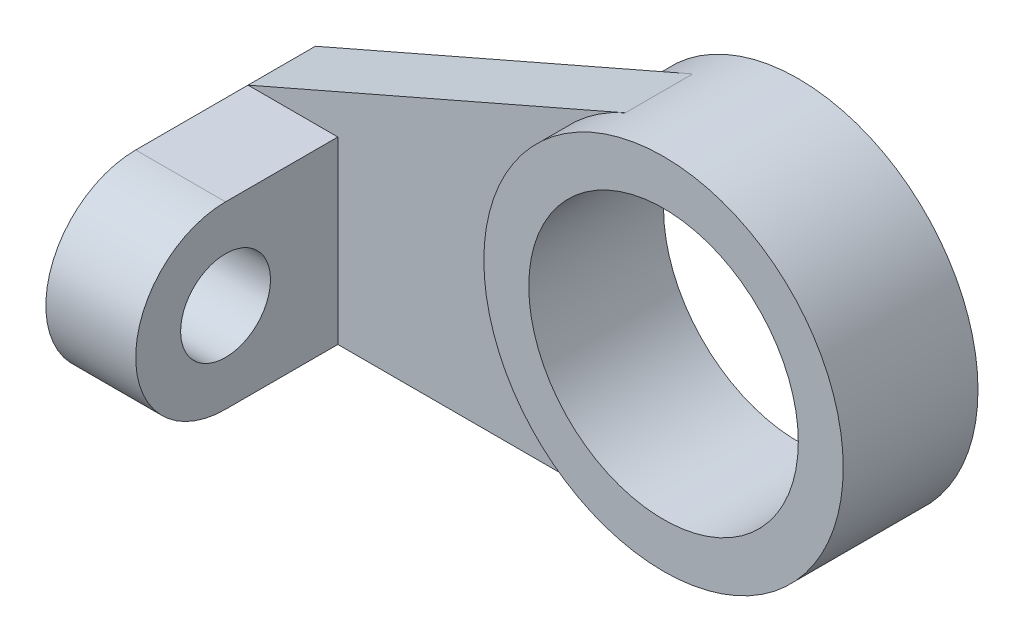
ISO-10303-21;
HEADER;
FILE_DESCRIPTION(('STEP AP214'),'2;1');
FILE_NAME('part.step','',(''),(''),'','','');
FILE_SCHEMA(('AUTOMOTIVE_DESIGN { 1 0 10303 214 1 1 1 1 }'));
ENDSEC;
DATA;
#1=APPLICATION_CONTEXT('core data for automotive mechanical design processes');
#2=APPLICATION_PROTOCOL_DEFINITION('international standard','automotive_design',2000,#1);
#3=PRODUCT_CONTEXT('',#1,'mechanical');
#4=PRODUCT('Part','Part','',(#3));
#5=PRODUCT_RELATED_PRODUCT_CATEGORY('part','',(#4));
#6=PRODUCT_DEFINITION_FORMATION('','',#4);
#7=PRODUCT_DEFINITION_CONTEXT('part definition',#1,'design');
#8=PRODUCT_DEFINITION('design','',#6,#7);
#9=PRODUCT_DEFINITION_SHAPE('','',#8);
#10=(LENGTH_UNIT() NAMED_UNIT(*) SI_UNIT(.MILLI.,.METRE.));
#11=(NAMED_UNIT(*) PLANE_ANGLE_UNIT() SI_UNIT($,.RADIAN.));
#12=(NAMED_UNIT(*) SI_UNIT($,.STERADIAN.) SOLID_ANGLE_UNIT());
#13=UNCERTAINTY_MEASURE_WITH_UNIT(LENGTH_MEASURE(1.E-05),#10,'distance_accuracy_value','');
#14=(GEOMETRIC_REPRESENTATION_CONTEXT(3) GLOBAL_UNCERTAINTY_ASSIGNED_CONTEXT((#13)) GLOBAL_UNIT_ASSIGNED_CONTEXT((#10,
#11,#12)) REPRESENTATION_CONTEXT('',''));
#15=CARTESIAN_POINT('',(0.,0.,0.));
#16=DIRECTION('',(0.,0.,1.));
#17=DIRECTION('',(1.,0.,0.));
#18=AXIS2_PLACEMENT_3D('',#15,#16,#17);
#19=CARTESIAN_POINT('',(0.,0.,9.525));
#20=DIRECTION('',(0.,0.,1.));
#21=DIRECTION('',(1.,0.,0.));
#22=AXIS2_PLACEMENT_3D('',#19,#20,#21);
#23=PLANE('',#22);
#24=DIRECTION('',(-1.,0.,0.));
#25=VECTOR('',#24,1.);
#26=CARTESIAN_POINT('',(-127.,0.,9.525));
#27=LINE('',#26,#25);
#28=CARTESIAN_POINT('',(-101.6,0.,9.525));
#29=VERTEX_POINT('',#28);
#30=CARTESIAN_POINT('',(-127.,0.,9.525));
#31=VERTEX_POINT('',#30);
#32=EDGE_CURVE('E136',#29,#31,#27,.T.);
#33=ORIENTED_EDGE('',*,*,#32,.F.);
#34=DIRECTION('',(0.,1.,0.));
#35=VECTOR('',#34,1.);
#36=CARTESIAN_POINT('',(-101.6,-50.8,9.525));
#37=LINE('',#36,#35);
#38=CARTESIAN_POINT('',(-101.6,-50.8,9.525));
#39=VERTEX_POINT('',#38);
#40=EDGE_CURVE('E146',#39,#29,#37,.T.);
#41=ORIENTED_EDGE('',*,*,#40,.F.);
#42=DIRECTION('',(1.,0.,0.));
#43=VECTOR('',#42,1.);
#44=CARTESIAN_POINT('',(0.,-50.8,9.525));
#45=LINE('',#44,#43);
#46=CARTESIAN_POINT('',(0.,-50.8,9.525));
#47=VERTEX_POINT('',#46);
#48=EDGE_CURVE('E176',#39,#47,#45,.T.);
#49=ORIENTED_EDGE('',*,*,#48,.T.);
#50=CARTESIAN_POINT('',(0.,0.,9.525));
#51=DIRECTION('',(0.,0.,-1.));
#52=DIRECTION('',(1.,0.,0.));
#53=AXIS2_PLACEMENT_3D('',#50,#51,#52);
#54=CIRCLE('',#53,50.8);
#55=CARTESIAN_POINT('',(-20.32,46.5589690607513,9.525));
#56=VERTEX_POINT('',#55);
#57=EDGE_CURVE('E167',#47,#56,#54,.T.);
#58=ORIENTED_EDGE('',*,*,#57,.T.);
#59=DIRECTION('',(-0.916515138991168,-0.4,0.));
#60=VECTOR('',#59,1.);
#61=CARTESIAN_POINT('',(-127.,0.,9.525));
#62=LINE('',#61,#60);
#63=EDGE_CURVE('E171',#56,#31,#62,.T.);
#64=ORIENTED_EDGE('',*,*,#63,.T.);
#65=EDGE_LOOP('',(#33,#41,#49,#58,#64));
#66=FACE_BOUND('',#65,.T.);
#67=ADVANCED_FACE('F51',(#66),#23,.T.);
#68=CARTESIAN_POINT('',(0.,0.,19.05));
#69=DIRECTION('',(0.,0.,1.));
#70=DIRECTION('',(1.,0.,0.));
#71=AXIS2_PLACEMENT_3D('',#68,#69,#70);
#72=PLANE('',#71);
#73=CARTESIAN_POINT('',(0.,0.,19.05));
#74=DIRECTION('',(0.,0.,1.));
#75=DIRECTION('',(1.,0.,0.));
#76=AXIS2_PLACEMENT_3D('',#73,#74,#75);
#77=CIRCLE('',#76,50.8);
#78=CARTESIAN_POINT('',(50.8,0.,19.05));
#79=VERTEX_POINT('',#78);
#80=EDGE_CURVE('E12',#79,#79,#77,.T.);
#81=ORIENTED_EDGE('',*,*,#80,.T.);
#82=EDGE_LOOP('',(#81));
#83=FACE_BOUND('',#82,.T.);
#84=CARTESIAN_POINT('',(0.,0.,19.05));
#85=DIRECTION('',(0.,0.,1.));
#86=DIRECTION('',(1.,0.,0.));
#87=AXIS2_PLACEMENT_3D('',#84,#85,#86);
#88=CIRCLE('',#87,38.1);
#89=CARTESIAN_POINT('',(-38.1,0.,19.05));
#90=VERTEX_POINT('',#89);
#91=EDGE_CURVE('E195',#90,#90,#88,.T.);
#92=ORIENTED_EDGE('',*,*,#91,.F.);
#93=EDGE_LOOP('',(#92));
#94=FACE_BOUND('',#93,.T.);
#95=ADVANCED_FACE('F218',(#83,#94),#72,.T.);
#96=CARTESIAN_POINT('',(0.,0.,-19.05));
#97=DIRECTION('',(0.,0.,1.));
#98=DIRECTION('',(1.,0.,0.));
#99=AXIS2_PLACEMENT_3D('',#96,#97,#98);
#100=PLANE('',#99);
#101=CARTESIAN_POINT('',(0.,0.,-19.05));
#102=DIRECTION('',(0.,0.,1.));
#103=DIRECTION('',(1.,0.,0.));
#104=AXIS2_PLACEMENT_3D('',#101,#102,#103);
#105=CIRCLE('',#104,50.8);
#106=CARTESIAN_POINT('',(50.8,0.,-19.05));
#107=VERTEX_POINT('',#106);
#108=EDGE_CURVE('E55',#107,#107,#105,.T.);
#109=ORIENTED_EDGE('',*,*,#108,.F.);
#110=EDGE_LOOP('',(#109));
#111=FACE_BOUND('',#110,.T.);
#112=CARTESIAN_POINT('',(0.,0.,-19.05));
#113=DIRECTION('',(0.,0.,1.));
#114=DIRECTION('',(1.,0.,0.));
#115=AXIS2_PLACEMENT_3D('',#112,#113,#114);
#116=CIRCLE('',#115,38.1);
#117=CARTESIAN_POINT('',(-38.1,0.,-19.05));
#118=VERTEX_POINT('',#117);
#119=EDGE_CURVE('E194',#118,#118,#116,.T.);
#120=ORIENTED_EDGE('',*,*,#119,.T.);
#121=EDGE_LOOP('',(#120));
#122=FACE_BOUND('',#121,.T.);
#123=ADVANCED_FACE('F203',(#111,#122),#100,.F.);
#124=CARTESIAN_POINT('',(0.,0.,19.05));
#125=DIRECTION('',(0.,0.,-1.));
#126=DIRECTION('',(-1.,0.,0.));
#127=AXIS2_PLACEMENT_3D('',#124,#125,#126);
#128=CYLINDRICAL_SURFACE('',#127,50.8);
#129=DIRECTION('',(0.,0.,-1.));
#130=VECTOR('',#129,1.);
#131=CARTESIAN_POINT('',(-20.32,46.5589690607513,9.525));
#132=LINE('',#131,#130);
#133=CARTESIAN_POINT('',(-20.32,46.5589690607513,-9.525));
#134=VERTEX_POINT('',#133);
#135=EDGE_CURVE('E75',#56,#134,#132,.T.);
#136=ORIENTED_EDGE('',*,*,#135,.F.);
#137=ORIENTED_EDGE('',*,*,#57,.F.);
#138=DIRECTION('',(0.,0.,-1.));
#139=VECTOR('',#138,1.);
#140=CARTESIAN_POINT('',(0.,-50.8,9.525));
#141=LINE('',#140,#139);
#142=CARTESIAN_POINT('',(0.,-50.8,-9.525));
#143=VERTEX_POINT('',#142);
#144=EDGE_CURVE('E124',#47,#143,#141,.T.);
#145=ORIENTED_EDGE('',*,*,#144,.T.);
#146=CARTESIAN_POINT('',(0.,0.,-9.525));
#147=DIRECTION('',(0.,0.,-1.));
#148=DIRECTION('',(1.,0.,0.));
#149=AXIS2_PLACEMENT_3D('',#146,#147,#148);
#150=CIRCLE('',#149,50.8);
#151=EDGE_CURVE('E166',#143,#134,#150,.T.);
#152=ORIENTED_EDGE('',*,*,#151,.T.);
#153=EDGE_LOOP('',(#136,#137,#145,#152));
#154=FACE_BOUND('',#153,.T.);
#155=ORIENTED_EDGE('',*,*,#80,.F.);
#156=EDGE_LOOP('',(#155));
#157=FACE_BOUND('',#156,.T.);
#158=ORIENTED_EDGE('',*,*,#108,.T.);
#159=EDGE_LOOP('',(#158));
#160=FACE_BOUND('',#159,.T.);
#161=ADVANCED_FACE('F53',(#154,#157,#160),#128,.T.);
#162=CARTESIAN_POINT('',(0.,0.,19.05));
#163=DIRECTION('',(0.,0.,-1.));
#164=DIRECTION('',(-1.,0.,0.));
#165=AXIS2_PLACEMENT_3D('',#162,#163,#164);
#166=CYLINDRICAL_SURFACE('',#165,38.1);
#167=CARTESIAN_POINT('',(-38.1,0.,19.05));
#168=CARTESIAN_POINT('',(-38.1,0.,18.653125));
#169=CARTESIAN_POINT('',(-38.1,0.,18.25625));
#170=CARTESIAN_POINT('',(-38.1,0.,17.4625));
#171=CARTESIAN_POINT('',(-38.1,0.,17.065625));
#172=CARTESIAN_POINT('',(-38.1,0.,16.271875));
#173=CARTESIAN_POINT('',(-38.1,0.,15.875));
#174=CARTESIAN_POINT('',(-38.1,0.,15.08125));
#175=CARTESIAN_POINT('',(-38.1,0.,14.684375));
#176=CARTESIAN_POINT('',(-38.1,0.,13.890625));
#177=CARTESIAN_POINT('',(-38.1,0.,13.49375));
#178=CARTESIAN_POINT('',(-38.1,0.,12.7));
#179=CARTESIAN_POINT('',(-38.1,0.,12.303125));
#180=CARTESIAN_POINT('',(-38.1,0.,11.509375));
#181=CARTESIAN_POINT('',(-38.1,0.,11.1125));
#182=CARTESIAN_POINT('',(-38.1,0.,10.31875));
#183=CARTESIAN_POINT('',(-38.1,0.,9.921875));
#184=CARTESIAN_POINT('',(-38.1,0.,9.128125));
#185=CARTESIAN_POINT('',(-38.1,0.,8.73125));
#186=CARTESIAN_POINT('',(-38.1,0.,7.9375));
#187=CARTESIAN_POINT('',(-38.1,0.,7.540625));
#188=CARTESIAN_POINT('',(-38.1,0.,6.746875));
#189=CARTESIAN_POINT('',(-38.1,0.,6.35));
#190=CARTESIAN_POINT('',(-38.1,0.,5.55625));
#191=CARTESIAN_POINT('',(-38.1,0.,5.159375));
#192=CARTESIAN_POINT('',(-38.1,0.,4.365625));
#193=CARTESIAN_POINT('',(-38.1,0.,3.96875));
#194=CARTESIAN_POINT('',(-38.1,0.,3.175));
#195=CARTESIAN_POINT('',(-38.1,0.,2.778125));
#196=CARTESIAN_POINT('',(-38.1,0.,1.984375));
#197=CARTESIAN_POINT('',(-38.1,0.,1.5875));
#198=CARTESIAN_POINT('',(-38.1,0.,0.79375));
#199=CARTESIAN_POINT('',(-38.1,0.,0.396875));
#200=CARTESIAN_POINT('',(-38.1,0.,-0.396875));
#201=CARTESIAN_POINT('',(-38.1,0.,-0.79375));
#202=CARTESIAN_POINT('',(-38.1,0.,-1.5875));
#203=CARTESIAN_POINT('',(-38.1,0.,-1.984375));
#204=CARTESIAN_POINT('',(-38.1,0.,-2.778125));
#205=CARTESIAN_POINT('',(-38.1,0.,-3.175));
#206=CARTESIAN_POINT('',(-38.1,0.,-3.96875));
#207=CARTESIAN_POINT('',(-38.1,0.,-4.365625));
#208=CARTESIAN_POINT('',(-38.1,0.,-5.159375));
#209=CARTESIAN_POINT('',(-38.1,0.,-5.55625));
#210=CARTESIAN_POINT('',(-38.1,0.,-6.35));
#211=CARTESIAN_POINT('',(-38.1,0.,-6.746875));
#212=CARTESIAN_POINT('',(-38.1,0.,-7.540625));
#213=CARTESIAN_POINT('',(-38.1,0.,-7.9375));
#214=CARTESIAN_POINT('',(-38.1,0.,-8.73125));
#215=CARTESIAN_POINT('',(-38.1,0.,-9.128125));
#216=CARTESIAN_POINT('',(-38.1,0.,-9.921875));
#217=CARTESIAN_POINT('',(-38.1,0.,-10.31875));
#218=CARTESIAN_POINT('',(-38.1,0.,-11.1125));
#219=CARTESIAN_POINT('',(-38.1,0.,-11.509375));
#220=CARTESIAN_POINT('',(-38.1,0.,-12.303125));
#221=CARTESIAN_POINT('',(-38.1,0.,-12.7));
#222=CARTESIAN_POINT('',(-38.1,0.,-13.49375));
#223=CARTESIAN_POINT('',(-38.1,0.,-13.890625));
#224=CARTESIAN_POINT('',(-38.1,0.,-14.684375));
#225=CARTESIAN_POINT('',(-38.1,0.,-15.08125));
#226=CARTESIAN_POINT('',(-38.1,0.,-15.875));
#227=CARTESIAN_POINT('',(-38.1,0.,-16.271875));
#228=CARTESIAN_POINT('',(-38.1,0.,-17.065625));
#229=CARTESIAN_POINT('',(-38.1,0.,-17.4625));
#230=CARTESIAN_POINT('',(-38.1,0.,-18.25625));
#231=CARTESIAN_POINT('',(-38.1,0.,-18.653125));
#232=CARTESIAN_POINT('',(-38.1,0.,-19.05));
#233=B_SPLINE_CURVE_WITH_KNOTS('',3,(#167,#168,#169,#170,#171,#172,#173,#174,#175,#176,#177,
#178,#179,#180,#181,#182,#183,#184,#185,#186,#187,#188,#189,#190,#191,#192,#193,#194,#195,#196,
#197,#198,#199,#200,#201,#202,#203,#204,#205,#206,#207,#208,#209,#210,#211,#212,#213,#214,#215,
#216,#217,#218,#219,#220,#221,#222,#223,#224,#225,#226,#227,#228,#229,#230,#231,#232),
.UNSPECIFIED.,.F.,.F.,(4,2,2,2,2,2,2,2,2,2,2,2,2,2,2,2,2,2,2,2,2,2,2,2,2,2,2,2,2,2,2,2,4),(0.,
1.190625,2.38125,3.571875,4.7625,5.953125,7.14375,8.334375,9.525,10.715625,11.90625,13.096875,
14.2875,15.478125,16.66875,17.859375,19.05,20.240625,21.43125,22.621875,23.8125,25.003125,
26.19375,27.384375,28.575,29.765625,30.95625,32.146875,33.3375,34.528125,35.71875,36.909375,
38.1),.UNSPECIFIED.);
#234=EDGE_CURVE('BSEAM205',#90,#118,#233,.T.);
#235=ORIENTED_EDGE('',*,*,#91,.T.);
#236=ORIENTED_EDGE('',*,*,#119,.F.);
#237=ORIENTED_EDGE('',*,*,#234,.T.);
#238=ORIENTED_EDGE('',*,*,#234,.F.);
#239=EDGE_LOOP('',(#235,#237,#236,#238));
#240=FACE_BOUND('',#239,.T.);
#241=ADVANCED_FACE('F205',(#240),#166,.F.);
#242=CARTESIAN_POINT('',(-127.,0.,9.525));
#243=DIRECTION('',(0.4,-0.916515138991168,0.));
#244=DIRECTION('',(0.916515138991168,0.4,0.));
#245=AXIS2_PLACEMENT_3D('',#242,#243,#244);
#246=PLANE('',#245);
#247=DIRECTION('',(-0.916515138991168,-0.4,0.));
#248=VECTOR('',#247,1.);
#249=CARTESIAN_POINT('',(-127.,0.,-9.525));
#250=LINE('',#249,#248);
#251=CARTESIAN_POINT('',(-127.,0.,-9.525));
#252=VERTEX_POINT('',#251);
#253=EDGE_CURVE('E181',#134,#252,#250,.T.);
#254=ORIENTED_EDGE('',*,*,#253,.T.);
#255=DIRECTION('',(0.,0.,-1.));
#256=VECTOR('',#255,1.);
#257=CARTESIAN_POINT('',(-127.,0.,9.525));
#258=LINE('',#257,#256);
#259=EDGE_CURVE('E123',#31,#252,#258,.T.);
#260=ORIENTED_EDGE('',*,*,#259,.F.);
#261=ORIENTED_EDGE('',*,*,#63,.F.);
#262=ORIENTED_EDGE('',*,*,#135,.T.);
#263=EDGE_LOOP('',(#254,#260,#261,#262));
#264=FACE_BOUND('',#263,.T.);
#265=ADVANCED_FACE('F207',(#264),#246,.F.);
#266=CARTESIAN_POINT('',(-127.,-50.8,9.525));
#267=DIRECTION('',(1.,0.,0.));
#268=DIRECTION('',(0.,0.,-1.));
#269=AXIS2_PLACEMENT_3D('',#266,#267,#268);
#270=PLANE('',#269);
#271=DIRECTION('',(0.,0.,-1.));
#272=VECTOR('',#271,1.);
#273=CARTESIAN_POINT('',(-127.,-50.8,9.525));
#274=LINE('',#273,#272);
#275=CARTESIAN_POINT('',(-127.,-50.8,41.275));
#276=VERTEX_POINT('',#275);
#277=CARTESIAN_POINT('',(-127.,-50.8,-9.525));
#278=VERTEX_POINT('',#277);
#279=EDGE_CURVE('E109',#276,#278,#274,.T.);
#280=ORIENTED_EDGE('',*,*,#279,.F.);
#281=CARTESIAN_POINT('',(-127.,-25.4,41.275));
#282=DIRECTION('',(-1.,0.,0.));
#283=DIRECTION('',(0.,0.,1.));
#284=AXIS2_PLACEMENT_3D('',#281,#282,#283);
#285=CIRCLE('',#284,25.4);
#286=CARTESIAN_POINT('',(-127.,0.,41.275));
#287=VERTEX_POINT('',#286);
#288=EDGE_CURVE('E115',#276,#287,#285,.T.);
#289=ORIENTED_EDGE('',*,*,#288,.T.);
#290=DIRECTION('',(0.,0.,-1.));
#291=VECTOR('',#290,1.);
#292=CARTESIAN_POINT('',(-127.,0.,41.275));
#293=LINE('',#292,#291);
#294=EDGE_CURVE('E155',#287,#31,#293,.T.);
#295=ORIENTED_EDGE('',*,*,#294,.T.);
#296=ORIENTED_EDGE('',*,*,#259,.T.);
#297=DIRECTION('',(0.,-1.,0.));
#298=VECTOR('',#297,1.);
#299=CARTESIAN_POINT('',(-127.,-50.8,-9.525));
#300=LINE('',#299,#298);
#301=EDGE_CURVE('E118',#252,#278,#300,.T.);
#302=ORIENTED_EDGE('',*,*,#301,.T.);
#303=EDGE_LOOP('',(#280,#289,#295,#296,#302));
#304=FACE_BOUND('',#303,.T.);
#305=CARTESIAN_POINT('',(-127.,-25.4,41.275));
#306=DIRECTION('',(-1.,0.,0.));
#307=DIRECTION('',(0.,0.,1.));
#308=AXIS2_PLACEMENT_3D('',#305,#306,#307);
#309=CIRCLE('',#308,12.7);
#310=CARTESIAN_POINT('',(-127.,-25.4,53.975));
#311=VERTEX_POINT('',#310);
#312=EDGE_CURVE('E149',#311,#311,#309,.T.);
#313=ORIENTED_EDGE('',*,*,#312,.F.);
#314=EDGE_LOOP('',(#313));
#315=FACE_BOUND('',#314,.T.);
#316=ADVANCED_FACE('F111',(#304,#315),#270,.F.);
#317=CARTESIAN_POINT('',(0.,-50.8,9.525));
#318=DIRECTION('',(0.,1.,0.));
#319=DIRECTION('',(-1.,0.,0.));
#320=AXIS2_PLACEMENT_3D('',#317,#318,#319);
#321=PLANE('',#320);
#322=DIRECTION('',(1.,0.,0.));
#323=VECTOR('',#322,1.);
#324=CARTESIAN_POINT('',(0.,-50.8,-9.525));
#325=LINE('',#324,#323);
#326=EDGE_CURVE('E172',#278,#143,#325,.T.);
#327=ORIENTED_EDGE('',*,*,#326,.T.);
#328=ORIENTED_EDGE('',*,*,#144,.F.);
#329=ORIENTED_EDGE('',*,*,#48,.F.);
#330=DIRECTION('',(0.,0.,-1.));
#331=VECTOR('',#330,1.);
#332=CARTESIAN_POINT('',(-101.6,-50.8,41.275));
#333=LINE('',#332,#331);
#334=CARTESIAN_POINT('',(-101.6,-50.8,41.275));
#335=VERTEX_POINT('',#334);
#336=EDGE_CURVE('E130',#335,#39,#333,.T.);
#337=ORIENTED_EDGE('',*,*,#336,.F.);
#338=DIRECTION('',(1.,0.,0.));
#339=VECTOR('',#338,1.);
#340=CARTESIAN_POINT('',(-127.,-50.8,41.275));
#341=LINE('',#340,#339);
#342=EDGE_CURVE('E127',#276,#335,#341,.T.);
#343=ORIENTED_EDGE('',*,*,#342,.F.);
#344=ORIENTED_EDGE('',*,*,#279,.T.);
#345=EDGE_LOOP('',(#327,#328,#329,#337,#343,#344));
#346=FACE_BOUND('',#345,.T.);
#347=ADVANCED_FACE('F128',(#346),#321,.F.);
#348=CARTESIAN_POINT('',(0.,0.,-9.525));
#349=DIRECTION('',(0.,0.,1.));
#350=DIRECTION('',(1.,0.,0.));
#351=AXIS2_PLACEMENT_3D('',#348,#349,#350);
#352=PLANE('',#351);
#353=ORIENTED_EDGE('',*,*,#151,.F.);
#354=ORIENTED_EDGE('',*,*,#326,.F.);
#355=ORIENTED_EDGE('',*,*,#301,.F.);
#356=ORIENTED_EDGE('',*,*,#253,.F.);
#357=EDGE_LOOP('',(#353,#354,#355,#356));
#358=FACE_BOUND('',#357,.T.);
#359=ADVANCED_FACE('F230',(#358),#352,.F.);
#360=CARTESIAN_POINT('',(-101.6,-50.8,41.275));
#361=DIRECTION('',(-1.,0.,0.));
#362=DIRECTION('',(0.,0.,1.));
#363=AXIS2_PLACEMENT_3D('',#360,#361,#362);
#364=PLANE('',#363);
#365=DIRECTION('',(0.,0.,-1.));
#366=VECTOR('',#365,1.);
#367=CARTESIAN_POINT('',(-101.6,0.,41.275));
#368=LINE('',#367,#366);
#369=CARTESIAN_POINT('',(-101.6,0.,41.275));
#370=VERTEX_POINT('',#369);
#371=EDGE_CURVE('E67',#370,#29,#368,.T.);
#372=ORIENTED_EDGE('',*,*,#371,.F.);
#373=CARTESIAN_POINT('',(-101.6,-25.4,41.275));
#374=DIRECTION('',(-1.,0.,0.));
#375=DIRECTION('',(0.,0.,1.));
#376=AXIS2_PLACEMENT_3D('',#373,#374,#375);
#377=CIRCLE('',#376,25.4);
#378=EDGE_CURVE('E141',#335,#370,#377,.T.);
#379=ORIENTED_EDGE('',*,*,#378,.F.);
#380=ORIENTED_EDGE('',*,*,#336,.T.);
#381=ORIENTED_EDGE('',*,*,#40,.T.);
#382=EDGE_LOOP('',(#372,#379,#380,#381));
#383=FACE_BOUND('',#382,.T.);
#384=CARTESIAN_POINT('',(-101.6,-25.4,41.275));
#385=DIRECTION('',(-1.,0.,0.));
#386=DIRECTION('',(0.,0.,1.));
#387=AXIS2_PLACEMENT_3D('',#384,#385,#386);
#388=CIRCLE('',#387,12.7);
#389=CARTESIAN_POINT('',(-101.6,-25.4,53.975));
#390=VERTEX_POINT('',#389);
#391=EDGE_CURVE('E142',#390,#390,#388,.T.);
#392=ORIENTED_EDGE('',*,*,#391,.T.);
#393=EDGE_LOOP('',(#392));
#394=FACE_BOUND('',#393,.T.);
#395=ADVANCED_FACE('F228',(#383,#394),#364,.F.);
#396=CARTESIAN_POINT('',(-127.,0.,41.275));
#397=DIRECTION('',(0.,-1.,0.));
#398=DIRECTION('',(0.,0.,-1.));
#399=AXIS2_PLACEMENT_3D('',#396,#397,#398);
#400=PLANE('',#399);
#401=ORIENTED_EDGE('',*,*,#32,.T.);
#402=ORIENTED_EDGE('',*,*,#294,.F.);
#403=DIRECTION('',(-1.,0.,0.));
#404=VECTOR('',#403,1.);
#405=CARTESIAN_POINT('',(-127.,0.,41.275));
#406=LINE('',#405,#404);
#407=EDGE_CURVE('E135',#370,#287,#406,.T.);
#408=ORIENTED_EDGE('',*,*,#407,.F.);
#409=ORIENTED_EDGE('',*,*,#371,.T.);
#410=EDGE_LOOP('',(#401,#402,#408,#409));
#411=FACE_BOUND('',#410,.T.);
#412=ADVANCED_FACE('F258',(#411),#400,.F.);
#413=CARTESIAN_POINT('',(-101.6,-25.4,41.275));
#414=DIRECTION('',(-1.,0.,0.));
#415=DIRECTION('',(0.,0.,1.));
#416=AXIS2_PLACEMENT_3D('',#413,#414,#415);
#417=CYLINDRICAL_SURFACE('',#416,25.4);
#418=ORIENTED_EDGE('',*,*,#342,.T.);
#419=ORIENTED_EDGE('',*,*,#378,.T.);
#420=ORIENTED_EDGE('',*,*,#407,.T.);
#421=ORIENTED_EDGE('',*,*,#288,.F.);
#422=EDGE_LOOP('',(#418,#419,#420,#421));
#423=FACE_BOUND('',#422,.T.);
#424=ADVANCED_FACE('F139',(#423),#417,.T.);
#425=CARTESIAN_POINT('',(-101.6,-25.4,41.275));
#426=DIRECTION('',(-1.,0.,0.));
#427=DIRECTION('',(0.,0.,1.));
#428=AXIS2_PLACEMENT_3D('',#425,#426,#427);
#429=CYLINDRICAL_SURFACE('',#428,12.7);
#430=ORIENTED_EDGE('',*,*,#312,.T.);
#431=EDGE_LOOP('',(#430));
#432=FACE_BOUND('',#431,.T.);
#433=ORIENTED_EDGE('',*,*,#391,.F.);
#434=EDGE_LOOP('',(#433));
#435=FACE_BOUND('',#434,.T.);
#436=ADVANCED_FACE('F269',(#432,#435),#429,.F.);
#437=CLOSED_SHELL('',(#67,#95,#123,#161,#241,#265,#316,#347,#359,#395,#412,#424,#436));
#438=MANIFOLD_SOLID_BREP('B2',#437);
#439=ADVANCED_BREP_SHAPE_REPRESENTATION('',(#18,#438),#14);
#440=SHAPE_DEFINITION_REPRESENTATION(#9,#439);
ENDSEC;
END-ISO-10303-21;
